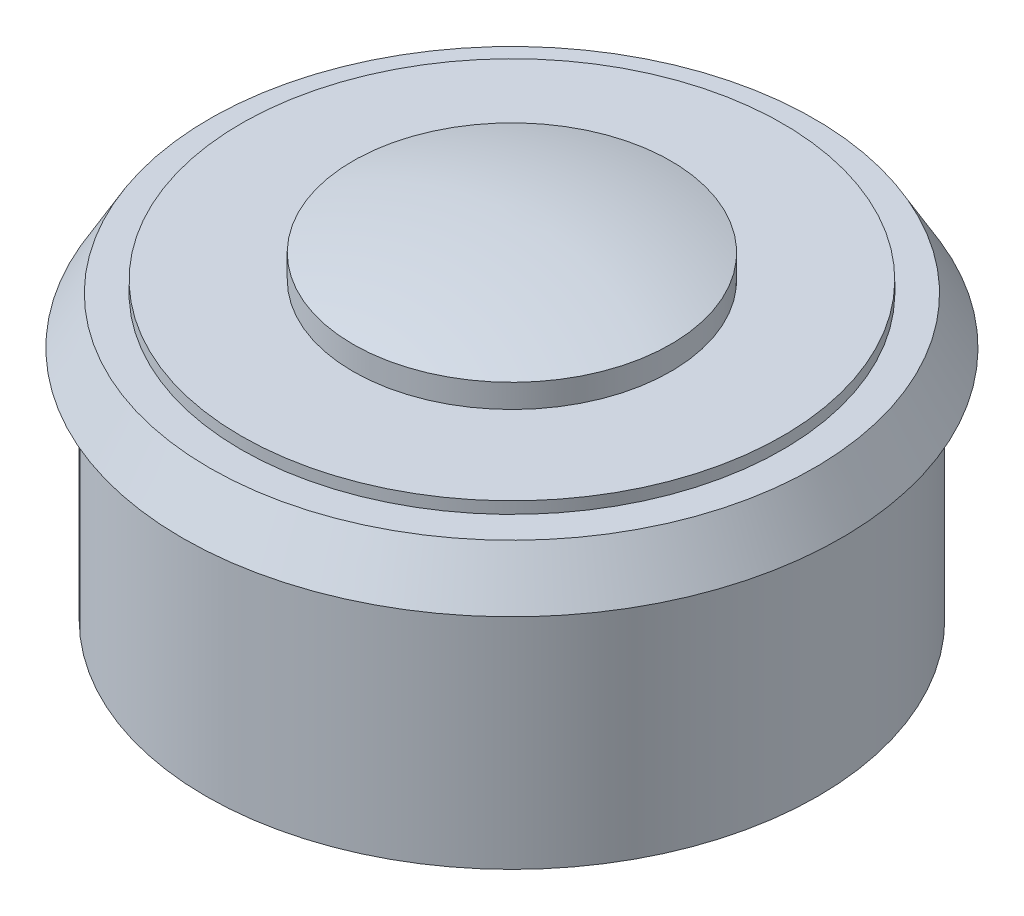
ISO-10303-21;
HEADER;
FILE_DESCRIPTION(('STEP AP214'),'2;1');
FILE_NAME('part.step','',(''),(''),'','','');
FILE_SCHEMA(('AUTOMOTIVE_DESIGN { 1 0 10303 214 1 1 1 1 }'));
ENDSEC;
DATA;
#1=APPLICATION_CONTEXT('core data for automotive mechanical design processes');
#2=APPLICATION_PROTOCOL_DEFINITION('international standard','automotive_design',2000,#1);
#3=PRODUCT_CONTEXT('',#1,'mechanical');
#4=PRODUCT('Part','Part','',(#3));
#5=PRODUCT_RELATED_PRODUCT_CATEGORY('part','',(#4));
#6=PRODUCT_DEFINITION_FORMATION('','',#4);
#7=PRODUCT_DEFINITION_CONTEXT('part definition',#1,'design');
#8=PRODUCT_DEFINITION('design','',#6,#7);
#9=PRODUCT_DEFINITION_SHAPE('','',#8);
#10=(LENGTH_UNIT() NAMED_UNIT(*) SI_UNIT(.MILLI.,.METRE.));
#11=(NAMED_UNIT(*) PLANE_ANGLE_UNIT() SI_UNIT($,.RADIAN.));
#12=(NAMED_UNIT(*) SI_UNIT($,.STERADIAN.) SOLID_ANGLE_UNIT());
#13=UNCERTAINTY_MEASURE_WITH_UNIT(LENGTH_MEASURE(1.E-05),#10,'distance_accuracy_value','');
#14=(GEOMETRIC_REPRESENTATION_CONTEXT(3) GLOBAL_UNCERTAINTY_ASSIGNED_CONTEXT((#13)) GLOBAL_UNIT_ASSIGNED_CONTEXT((#10,
#11,#12)) REPRESENTATION_CONTEXT('',''));
#15=CARTESIAN_POINT('',(0.,0.,0.));
#16=DIRECTION('',(0.,0.,1.));
#17=DIRECTION('',(1.,0.,0.));
#18=AXIS2_PLACEMENT_3D('',#15,#16,#17);
#19=CARTESIAN_POINT('',(0.,10.,0.));
#20=DIRECTION('',(0.,-1.,0.));
#21=DIRECTION('',(0.,0.,1.));
#22=AXIS2_PLACEMENT_3D('',#19,#20,#21);
#23=CONICAL_SURFACE('',#22,14.,0.5235987755983);
#24=CARTESIAN_POINT('',(0.,12.,0.));
#25=DIRECTION('',(0.,1.,0.));
#26=DIRECTION('',(0.,0.,1.));
#27=AXIS2_PLACEMENT_3D('',#24,#25,#26);
#28=CIRCLE('',#27,12.8452994616207);
#29=CARTESIAN_POINT('',(0.,12.,12.8452994616207));
#30=VERTEX_POINT('',#29);
#31=EDGE_CURVE('E53',#30,#30,#28,.T.);
#32=ORIENTED_EDGE('',*,*,#31,.F.);
#33=EDGE_LOOP('',(#32));
#34=FACE_BOUND('',#33,.T.);
#35=CARTESIAN_POINT('',(0.,10.,0.));
#36=DIRECTION('',(0.,1.,0.));
#37=DIRECTION('',(0.,0.,1.));
#38=AXIS2_PLACEMENT_3D('',#35,#36,#37);
#39=CIRCLE('',#38,14.);
#40=CARTESIAN_POINT('',(0.,10.,14.));
#41=VERTEX_POINT('',#40);
#42=EDGE_CURVE('E58',#41,#41,#39,.T.);
#43=ORIENTED_EDGE('',*,*,#42,.T.);
#44=EDGE_LOOP('',(#43));
#45=FACE_BOUND('',#44,.T.);
#46=ADVANCED_FACE('F40',(#34,#45),#23,.T.);
#47=CARTESIAN_POINT('',(0.,12.,0.));
#48=DIRECTION('',(0.,1.,0.));
#49=DIRECTION('',(0.,0.,1.));
#50=AXIS2_PLACEMENT_3D('',#47,#48,#49);
#51=PLANE('',#50);
#52=CARTESIAN_POINT('',(0.,12.,0.));
#53=DIRECTION('',(0.,1.,0.));
#54=DIRECTION('',(0.,0.,1.));
#55=AXIS2_PLACEMENT_3D('',#52,#53,#54);
#56=CIRCLE('',#55,11.5);
#57=CARTESIAN_POINT('',(0.,12.,11.5));
#58=VERTEX_POINT('',#57);
#59=EDGE_CURVE('E48',#58,#58,#56,.T.);
#60=ORIENTED_EDGE('',*,*,#59,.F.);
#61=EDGE_LOOP('',(#60));
#62=FACE_BOUND('',#61,.T.);
#63=ORIENTED_EDGE('',*,*,#31,.T.);
#64=EDGE_LOOP('',(#63));
#65=FACE_BOUND('',#64,.T.);
#66=ADVANCED_FACE('F64',(#62,#65),#51,.T.);
#67=CARTESIAN_POINT('',(0.,10.,0.));
#68=DIRECTION('',(0.,1.,0.));
#69=DIRECTION('',(0.,0.,1.));
#70=AXIS2_PLACEMENT_3D('',#67,#68,#69);
#71=PLANE('',#70);
#72=ORIENTED_EDGE('',*,*,#42,.F.);
#73=EDGE_LOOP('',(#72));
#74=FACE_BOUND('',#73,.T.);
#75=ADVANCED_FACE('F70',(#74),#71,.F.);
#76=CARTESIAN_POINT('',(0.,12.5,0.));
#77=DIRECTION('',(0.,-1.,0.));
#78=DIRECTION('',(0.,0.,-1.));
#79=AXIS2_PLACEMENT_3D('',#76,#77,#78);
#80=CYLINDRICAL_SURFACE('',#79,11.5);
#81=CARTESIAN_POINT('',(0.,12.5,0.));
#82=DIRECTION('',(0.,1.,0.));
#83=DIRECTION('',(0.,0.,1.));
#84=AXIS2_PLACEMENT_3D('',#81,#82,#83);
#85=CIRCLE('',#84,11.5);
#86=CARTESIAN_POINT('',(0.,12.5,11.5));
#87=VERTEX_POINT('',#86);
#88=EDGE_CURVE('E56',#87,#87,#85,.T.);
#89=ORIENTED_EDGE('',*,*,#88,.F.);
#90=EDGE_LOOP('',(#89));
#91=FACE_BOUND('',#90,.T.);
#92=ORIENTED_EDGE('',*,*,#59,.T.);
#93=EDGE_LOOP('',(#92));
#94=FACE_BOUND('',#93,.T.);
#95=ADVANCED_FACE('F72',(#91,#94),#80,.T.);
#96=CARTESIAN_POINT('',(0.,12.5,0.));
#97=DIRECTION('',(0.,1.,0.));
#98=DIRECTION('',(0.,0.,1.));
#99=AXIS2_PLACEMENT_3D('',#96,#97,#98);
#100=PLANE('',#99);
#101=CARTESIAN_POINT('',(0.,12.5,0.));
#102=DIRECTION('',(0.,1.,0.));
#103=DIRECTION('',(0.,0.,1.));
#104=AXIS2_PLACEMENT_3D('',#101,#102,#103);
#105=CIRCLE('',#104,6.75);
#106=CARTESIAN_POINT('',(0.,12.5,6.75));
#107=VERTEX_POINT('',#106);
#108=EDGE_CURVE('E11',#107,#107,#105,.T.);
#109=ORIENTED_EDGE('',*,*,#108,.F.);
#110=EDGE_LOOP('',(#109));
#111=FACE_BOUND('',#110,.T.);
#112=ORIENTED_EDGE('',*,*,#88,.T.);
#113=EDGE_LOOP('',(#112));
#114=FACE_BOUND('',#113,.T.);
#115=ADVANCED_FACE('F78',(#111,#114),#100,.T.);
#116=CARTESIAN_POINT('',(0.,13.5,0.));
#117=DIRECTION('',(0.,-1.,0.));
#118=DIRECTION('',(0.,0.,-1.));
#119=AXIS2_PLACEMENT_3D('',#116,#117,#118);
#120=CYLINDRICAL_SURFACE('',#119,6.75);
#121=CARTESIAN_POINT('',(0.,13.5,0.));
#122=DIRECTION('',(0.,1.,0.));
#123=DIRECTION('',(0.,0.,1.));
#124=AXIS2_PLACEMENT_3D('',#121,#122,#123);
#125=CIRCLE('',#124,6.75);
#126=CARTESIAN_POINT('',(0.,13.5,6.75));
#127=VERTEX_POINT('',#126);
#128=EDGE_CURVE('E44',#127,#127,#125,.T.);
#129=ORIENTED_EDGE('',*,*,#128,.F.);
#130=EDGE_LOOP('',(#129));
#131=FACE_BOUND('',#130,.T.);
#132=ORIENTED_EDGE('',*,*,#108,.T.);
#133=EDGE_LOOP('',(#132));
#134=FACE_BOUND('',#133,.T.);
#135=ADVANCED_FACE('F86',(#131,#134),#120,.T.);
#136=CARTESIAN_POINT('',(0.,-8.78124999999998,0.));
#137=DIRECTION('',(0.,0.,1.));
#138=DIRECTION('',(1.,0.,0.));
#139=AXIS2_PLACEMENT_3D('',#136,#137,#138);
#140=SPHERICAL_SURFACE('',#139,23.28125);
#141=CARTESIAN_POINT('',(0.,-8.78124999999998,0.));
#142=DIRECTION('',(0.,1.,0.));
#143=DIRECTION('',(0.,0.,1.));
#144=AXIS2_PLACEMENT_3D('',#141,#142,#143);
#145=SPHERICAL_SURFACE('',#144,23.28125);
#146=ORIENTED_EDGE('',*,*,#128,.T.);
#147=EDGE_LOOP('',(#146));
#148=FACE_BOUND('',#147,.T.);
#149=ADVANCED_FACE('F42',(#148),#145,.T.);
#150=CLOSED_SHELL('',(#46,#66,#75,#95,#115,#135,#149));
#151=MANIFOLD_SOLID_BREP('B2',#150);
#152=CARTESIAN_POINT('',(0.,10.,0.));
#153=DIRECTION('',(0.,-1.,0.));
#154=DIRECTION('',(0.,0.,-1.));
#155=AXIS2_PLACEMENT_3D('',#152,#153,#154);
#156=CYLINDRICAL_SURFACE('',#155,13.);
#157=CARTESIAN_POINT('',(0.,10.,0.));
#158=DIRECTION('',(0.,1.,0.));
#159=DIRECTION('',(0.,0.,1.));
#160=AXIS2_PLACEMENT_3D('',#157,#158,#159);
#161=CIRCLE('',#160,13.);
#162=CARTESIAN_POINT('',(0.,10.,13.));
#163=VERTEX_POINT('',#162);
#164=EDGE_CURVE('E39',#163,#163,#161,.T.);
#165=ORIENTED_EDGE('',*,*,#164,.F.);
#166=EDGE_LOOP('',(#165));
#167=FACE_BOUND('',#166,.T.);
#168=CARTESIAN_POINT('',(0.,0.,0.));
#169=DIRECTION('',(0.,1.,0.));
#170=DIRECTION('',(0.,0.,1.));
#171=AXIS2_PLACEMENT_3D('',#168,#169,#170);
#172=CIRCLE('',#171,13.);
#173=CARTESIAN_POINT('',(0.,0.,13.));
#174=VERTEX_POINT('',#173);
#175=EDGE_CURVE('E143',#174,#174,#172,.T.);
#176=ORIENTED_EDGE('',*,*,#175,.T.);
#177=EDGE_LOOP('',(#176));
#178=FACE_BOUND('',#177,.T.);
#179=ADVANCED_FACE('F140',(#167,#178),#156,.T.);
#180=CARTESIAN_POINT('',(0.,10.,0.));
#181=DIRECTION('',(0.,1.,0.));
#182=DIRECTION('',(0.,0.,1.));
#183=AXIS2_PLACEMENT_3D('',#180,#181,#182);
#184=PLANE('',#183);
#185=ORIENTED_EDGE('',*,*,#164,.T.);
#186=EDGE_LOOP('',(#185));
#187=FACE_BOUND('',#186,.T.);
#188=ADVANCED_FACE('F155',(#187),#184,.T.);
#189=CARTESIAN_POINT('',(0.,0.,0.));
#190=DIRECTION('',(0.,1.,0.));
#191=DIRECTION('',(0.,0.,1.));
#192=AXIS2_PLACEMENT_3D('',#189,#190,#191);
#193=PLANE('',#192);
#194=ORIENTED_EDGE('',*,*,#175,.F.);
#195=EDGE_LOOP('',(#194));
#196=FACE_BOUND('',#195,.T.);
#197=ADVANCED_FACE('F153',(#196),#193,.F.);
#198=CLOSED_SHELL('',(#179,#188,#197));
#199=MANIFOLD_SOLID_BREP('B6',#198);
#200=ADVANCED_BREP_SHAPE_REPRESENTATION('',(#18,#151,#199),#14);
#201=SHAPE_DEFINITION_REPRESENTATION(#9,#200);
ENDSEC;
END-ISO-10303-21;
